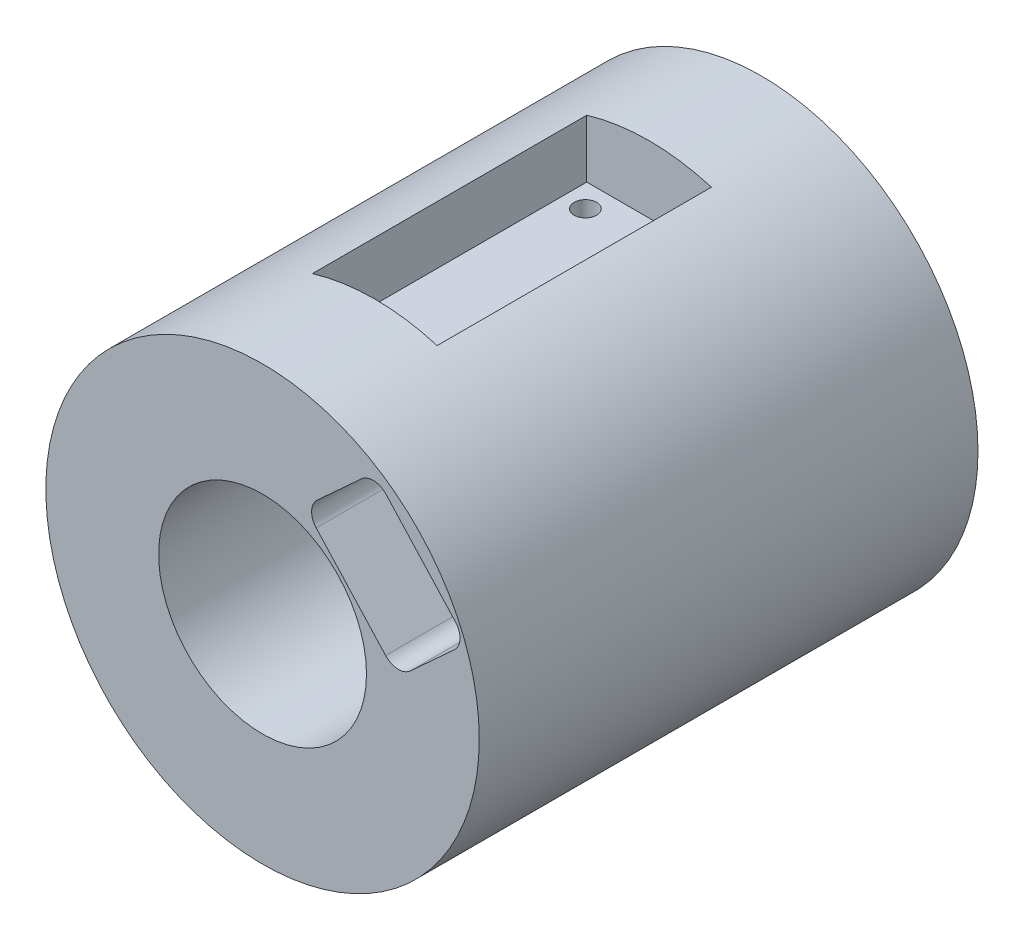
ISO-10303-21;
HEADER;
FILE_DESCRIPTION(('STEP AP214'),'2;1');
FILE_NAME('part.step','',(''),(''),'','','');
FILE_SCHEMA(('AUTOMOTIVE_DESIGN { 1 0 10303 214 1 1 1 1 }'));
ENDSEC;
DATA;
#1=APPLICATION_CONTEXT('core data for automotive mechanical design processes');
#2=APPLICATION_PROTOCOL_DEFINITION('international standard','automotive_design',2000,#1);
#3=PRODUCT_CONTEXT('',#1,'mechanical');
#4=PRODUCT('Part','Part','',(#3));
#5=PRODUCT_RELATED_PRODUCT_CATEGORY('part','',(#4));
#6=PRODUCT_DEFINITION_FORMATION('','',#4);
#7=PRODUCT_DEFINITION_CONTEXT('part definition',#1,'design');
#8=PRODUCT_DEFINITION('design','',#6,#7);
#9=PRODUCT_DEFINITION_SHAPE('','',#8);
#10=(LENGTH_UNIT() NAMED_UNIT(*) SI_UNIT(.MILLI.,.METRE.));
#11=(NAMED_UNIT(*) PLANE_ANGLE_UNIT() SI_UNIT($,.RADIAN.));
#12=(NAMED_UNIT(*) SI_UNIT($,.STERADIAN.) SOLID_ANGLE_UNIT());
#13=UNCERTAINTY_MEASURE_WITH_UNIT(LENGTH_MEASURE(1.E-05),#10,'distance_accuracy_value','');
#14=(GEOMETRIC_REPRESENTATION_CONTEXT(3) GLOBAL_UNCERTAINTY_ASSIGNED_CONTEXT((#13)) GLOBAL_UNIT_ASSIGNED_CONTEXT((#10,
#11,#12)) REPRESENTATION_CONTEXT('',''));
#15=CARTESIAN_POINT('',(0.,0.,0.));
#16=DIRECTION('',(0.,0.,1.));
#17=DIRECTION('',(1.,0.,0.));
#18=AXIS2_PLACEMENT_3D('',#15,#16,#17);
#19=CARTESIAN_POINT('',(0.,0.,100.));
#20=DIRECTION('',(0.,0.,-1.));
#21=DIRECTION('',(-1.,0.,0.));
#22=AXIS2_PLACEMENT_3D('',#19,#20,#21);
#23=CYLINDRICAL_SURFACE('',#22,43.45);
#24=CARTESIAN_POINT('',(0.,0.,100.));
#25=DIRECTION('',(0.,0.,1.));
#26=DIRECTION('',(1.,0.,0.));
#27=AXIS2_PLACEMENT_3D('',#24,#25,#26);
#28=CIRCLE('',#27,43.45);
#29=CARTESIAN_POINT('',(43.45,0.,100.));
#30=VERTEX_POINT('',#29);
#31=EDGE_CURVE('E321',#30,#30,#28,.T.);
#32=ORIENTED_EDGE('',*,*,#31,.F.);
#33=EDGE_LOOP('',(#32));
#34=FACE_BOUND('',#33,.T.);
#35=CARTESIAN_POINT('',(0.,0.,0.));
#36=DIRECTION('',(0.,0.,1.));
#37=DIRECTION('',(1.,0.,0.));
#38=AXIS2_PLACEMENT_3D('',#35,#36,#37);
#39=CIRCLE('',#38,43.45);
#40=CARTESIAN_POINT('',(43.45,0.,0.));
#41=VERTEX_POINT('',#40);
#42=EDGE_CURVE('E324',#41,#41,#39,.T.);
#43=ORIENTED_EDGE('',*,*,#42,.T.);
#44=EDGE_LOOP('',(#43));
#45=FACE_BOUND('',#44,.T.);
#46=CARTESIAN_POINT('',(0.,0.,77.5));
#47=DIRECTION('',(0.,0.,-1.));
#48=DIRECTION('',(-1.,0.,0.));
#49=AXIS2_PLACEMENT_3D('',#46,#47,#48);
#50=CIRCLE('',#49,43.45);
#51=CARTESIAN_POINT('',(-12.5,41.6131289378725,77.5));
#52=VERTEX_POINT('',#51);
#53=CARTESIAN_POINT('',(12.5,41.6131289378725,77.5));
#54=VERTEX_POINT('',#53);
#55=EDGE_CURVE('E327',#52,#54,#50,.T.);
#56=ORIENTED_EDGE('',*,*,#55,.F.);
#57=DIRECTION('',(0.,0.,-1.));
#58=VECTOR('',#57,1.);
#59=CARTESIAN_POINT('',(-12.5,41.6131289378725,100.));
#60=LINE('',#59,#58);
#61=CARTESIAN_POINT('',(-12.5,41.6131289378725,22.5));
#62=VERTEX_POINT('',#61);
#63=EDGE_CURVE('E50',#62,#52,#60,.F.);
#64=ORIENTED_EDGE('',*,*,#63,.F.);
#65=CARTESIAN_POINT('',(0.,0.,22.5));
#66=DIRECTION('',(0.,0.,1.));
#67=DIRECTION('',(1.,0.,0.));
#68=AXIS2_PLACEMENT_3D('',#65,#66,#67);
#69=CIRCLE('',#68,43.45);
#70=CARTESIAN_POINT('',(12.5,41.6131289378725,22.5));
#71=VERTEX_POINT('',#70);
#72=EDGE_CURVE('E334',#71,#62,#69,.T.);
#73=ORIENTED_EDGE('',*,*,#72,.F.);
#74=DIRECTION('',(0.,0.,-1.));
#75=VECTOR('',#74,1.);
#76=CARTESIAN_POINT('',(12.5,41.6131289378725,100.));
#77=LINE('',#76,#75);
#78=EDGE_CURVE('E330',#54,#71,#77,.T.);
#79=ORIENTED_EDGE('',*,*,#78,.F.);
#80=EDGE_LOOP('',(#56,#64,#73,#79));
#81=FACE_BOUND('',#80,.T.);
#82=ADVANCED_FACE('F42',(#34,#45,#81),#23,.T.);
#83=CARTESIAN_POINT('',(0.,0.,100.));
#84=DIRECTION('',(0.,0.,1.));
#85=DIRECTION('',(1.,0.,0.));
#86=AXIS2_PLACEMENT_3D('',#83,#84,#85);
#87=PLANE('',#86);
#88=CARTESIAN_POINT('',(22.1825162241844,30.8000411733465,100.));
#89=DIRECTION('',(0.,0.,1.));
#90=DIRECTION('',(1.,0.,0.));
#91=AXIS2_PLACEMENT_3D('',#88,#89,#90);
#92=CIRCLE('',#91,3.50000000000001);
#93=CARTESIAN_POINT('',(24.7629869029752,33.16460690005,100.));
#94=VERTEX_POINT('',#93);
#95=CARTESIAN_POINT('',(19.8179504974809,33.3805118521373,100.));
#96=VERTEX_POINT('',#95);
#97=EDGE_CURVE('E57',#94,#96,#92,.T.);
#98=ORIENTED_EDGE('',*,*,#97,.F.);
#99=DIRECTION('',(-0.675590207629567,0.737277336797381,0.));
#100=VECTOR('',#99,1.);
#101=CARTESIAN_POINT('',(38.6801451801443,17.976693762024,100.));
#102=LINE('',#101,#100);
#103=CARTESIAN_POINT('',(38.6801451801443,17.976693762024,100.));
#104=VERTEX_POINT('',#103);
#105=EDGE_CURVE('E166',#104,#94,#102,.T.);
#106=ORIENTED_EDGE('',*,*,#105,.F.);
#107=CARTESIAN_POINT('',(36.0996745013535,15.6121280353205,100.));
#108=DIRECTION('',(0.,0.,1.));
#109=DIRECTION('',(1.,0.,0.));
#110=AXIS2_PLACEMENT_3D('',#107,#108,#109);
#111=CIRCLE('',#110,3.5);
#112=CARTESIAN_POINT('',(38.4642402280569,13.0316573565296,100.));
#113=VERTEX_POINT('',#112);
#114=EDGE_CURVE('E170',#113,#104,#111,.T.);
#115=ORIENTED_EDGE('',*,*,#114,.F.);
#116=DIRECTION('',(0.737277336797381,0.675590207629567,0.));
#117=VECTOR('',#116,1.);
#118=CARTESIAN_POINT('',(29.6169121864884,4.92457486497485,100.));
#119=LINE('',#118,#117);
#120=CARTESIAN_POINT('',(29.6169121864884,4.92457486497485,100.));
#121=VERTEX_POINT('',#120);
#122=EDGE_CURVE('E209',#121,#113,#119,.T.);
#123=ORIENTED_EDGE('',*,*,#122,.F.);
#124=CARTESIAN_POINT('',(27.2523464597849,7.50504554376566,100.));
#125=DIRECTION('',(0.,0.,1.));
#126=DIRECTION('',(1.,0.,0.));
#127=AXIS2_PLACEMENT_3D('',#124,#125,#126);
#128=CIRCLE('',#127,3.5);
#129=CARTESIAN_POINT('',(24.671875780994,5.14047981706219,100.));
#130=VERTEX_POINT('',#129);
#131=EDGE_CURVE('E205',#130,#121,#128,.T.);
#132=ORIENTED_EDGE('',*,*,#131,.F.);
#133=DIRECTION('',(0.675590207629567,-0.737277336797381,0.));
#134=VECTOR('',#133,1.);
#135=CARTESIAN_POINT('',(10.754717503825,20.3283929550882,100.));
#136=LINE('',#135,#134);
#137=CARTESIAN_POINT('',(10.754717503825,20.3283929550882,100.));
#138=VERTEX_POINT('',#137);
#139=EDGE_CURVE('E201',#138,#130,#136,.T.);
#140=ORIENTED_EDGE('',*,*,#139,.F.);
#141=CARTESIAN_POINT('',(13.3351881826158,22.6929586817917,100.));
#142=DIRECTION('',(0.,0.,1.));
#143=DIRECTION('',(1.,0.,0.));
#144=AXIS2_PLACEMENT_3D('',#141,#142,#143);
#145=CIRCLE('',#144,3.5);
#146=CARTESIAN_POINT('',(10.9706224559123,25.2734293605826,100.));
#147=VERTEX_POINT('',#146);
#148=EDGE_CURVE('E197',#147,#138,#145,.T.);
#149=ORIENTED_EDGE('',*,*,#148,.F.);
#150=DIRECTION('',(-0.737277336797381,-0.675590207629567,0.));
#151=VECTOR('',#150,1.);
#152=CARTESIAN_POINT('',(19.8179504974809,33.3805118521373,100.));
#153=LINE('',#152,#151);
#154=EDGE_CURVE('E194',#96,#147,#153,.T.);
#155=ORIENTED_EDGE('',*,*,#154,.F.);
#156=EDGE_LOOP('',(#98,#106,#115,#123,#132,#140,#149,#155));
#157=FACE_BOUND('',#156,.T.);
#158=ORIENTED_EDGE('',*,*,#31,.T.);
#159=EDGE_LOOP('',(#158));
#160=FACE_BOUND('',#159,.T.);
#161=CARTESIAN_POINT('',(0.,0.,100.));
#162=DIRECTION('',(0.,0.,1.));
#163=DIRECTION('',(1.,0.,0.));
#164=AXIS2_PLACEMENT_3D('',#161,#162,#163);
#165=CIRCLE('',#164,20.8375);
#166=CARTESIAN_POINT('',(20.8375,0.,100.));
#167=VERTEX_POINT('',#166);
#168=EDGE_CURVE('E358',#167,#167,#165,.T.);
#169=ORIENTED_EDGE('',*,*,#168,.F.);
#170=EDGE_LOOP('',(#169));
#171=FACE_BOUND('',#170,.T.);
#172=ADVANCED_FACE('F305',(#157,#160,#171),#87,.T.);
#173=CARTESIAN_POINT('',(0.,0.,0.));
#174=DIRECTION('',(0.,0.,1.));
#175=DIRECTION('',(1.,0.,0.));
#176=AXIS2_PLACEMENT_3D('',#173,#174,#175);
#177=PLANE('',#176);
#178=ORIENTED_EDGE('',*,*,#42,.F.);
#179=EDGE_LOOP('',(#178));
#180=FACE_BOUND('',#179,.T.);
#181=CARTESIAN_POINT('',(0.,0.,0.));
#182=DIRECTION('',(0.,0.,1.));
#183=DIRECTION('',(1.,0.,0.));
#184=AXIS2_PLACEMENT_3D('',#181,#182,#183);
#185=CIRCLE('',#184,20.8375);
#186=CARTESIAN_POINT('',(20.8375,0.,0.));
#187=VERTEX_POINT('',#186);
#188=EDGE_CURVE('E357',#187,#187,#185,.T.);
#189=ORIENTED_EDGE('',*,*,#188,.T.);
#190=EDGE_LOOP('',(#189));
#191=FACE_BOUND('',#190,.T.);
#192=ADVANCED_FACE('F303',(#180,#191),#177,.F.);
#193=CARTESIAN_POINT('',(0.,0.,100.));
#194=DIRECTION('',(0.,0.,-1.));
#195=DIRECTION('',(-1.,0.,0.));
#196=AXIS2_PLACEMENT_3D('',#193,#194,#195);
#197=CYLINDRICAL_SURFACE('',#196,20.8375);
#198=ORIENTED_EDGE('',*,*,#168,.T.);
#199=EDGE_LOOP('',(#198));
#200=FACE_BOUND('',#199,.T.);
#201=ORIENTED_EDGE('',*,*,#188,.F.);
#202=EDGE_LOOP('',(#201));
#203=FACE_BOUND('',#202,.T.);
#204=ADVANCED_FACE('F299',(#200,#203),#197,.F.);
#205=CARTESIAN_POINT('',(12.5,43.45,77.5));
#206=DIRECTION('',(-1.,0.,0.));
#207=DIRECTION('',(0.,0.,1.));
#208=AXIS2_PLACEMENT_3D('',#205,#206,#207);
#209=PLANE('',#208);
#210=ORIENTED_EDGE('',*,*,#78,.T.);
#211=DIRECTION('',(0.,-1.,0.));
#212=VECTOR('',#211,1.);
#213=CARTESIAN_POINT('',(12.5,43.45,22.5));
#214=LINE('',#213,#212);
#215=CARTESIAN_POINT('',(12.5,30.,22.5));
#216=VERTEX_POINT('',#215);
#217=EDGE_CURVE('E350',#71,#216,#214,.T.);
#218=ORIENTED_EDGE('',*,*,#217,.T.);
#219=DIRECTION('',(0.,0.,-1.));
#220=VECTOR('',#219,1.);
#221=CARTESIAN_POINT('',(12.5,30.,77.5));
#222=LINE('',#221,#220);
#223=CARTESIAN_POINT('',(12.5,30.,77.5));
#224=VERTEX_POINT('',#223);
#225=EDGE_CURVE('E381',#224,#216,#222,.T.);
#226=ORIENTED_EDGE('',*,*,#225,.F.);
#227=DIRECTION('',(0.,-1.,0.));
#228=VECTOR('',#227,1.);
#229=CARTESIAN_POINT('',(12.5,43.45,77.5));
#230=LINE('',#229,#228);
#231=EDGE_CURVE('E346',#54,#224,#230,.T.);
#232=ORIENTED_EDGE('',*,*,#231,.F.);
#233=EDGE_LOOP('',(#210,#218,#226,#232));
#234=FACE_BOUND('',#233,.T.);
#235=ADVANCED_FACE('F295',(#234),#209,.T.);
#236=CARTESIAN_POINT('',(-12.5,43.45,22.5));
#237=DIRECTION('',(0.,0.,1.));
#238=DIRECTION('',(1.,0.,0.));
#239=AXIS2_PLACEMENT_3D('',#236,#237,#238);
#240=PLANE('',#239);
#241=ORIENTED_EDGE('',*,*,#217,.F.);
#242=ORIENTED_EDGE('',*,*,#72,.T.);
#243=DIRECTION('',(0.,-1.,0.));
#244=VECTOR('',#243,1.);
#245=CARTESIAN_POINT('',(-12.5,43.45,22.5));
#246=LINE('',#245,#244);
#247=CARTESIAN_POINT('',(-12.5,30.,22.5));
#248=VERTEX_POINT('',#247);
#249=EDGE_CURVE('E340',#62,#248,#246,.T.);
#250=ORIENTED_EDGE('',*,*,#249,.T.);
#251=DIRECTION('',(-1.,0.,0.));
#252=VECTOR('',#251,1.);
#253=CARTESIAN_POINT('',(-12.5,30.,22.5));
#254=LINE('',#253,#252);
#255=EDGE_CURVE('E376',#216,#248,#254,.T.);
#256=ORIENTED_EDGE('',*,*,#255,.F.);
#257=EDGE_LOOP('',(#241,#242,#250,#256));
#258=FACE_BOUND('',#257,.T.);
#259=ADVANCED_FACE('F291',(#258),#240,.T.);
#260=CARTESIAN_POINT('',(-12.5,43.45,77.5));
#261=DIRECTION('',(1.,0.,0.));
#262=DIRECTION('',(0.,0.,-1.));
#263=AXIS2_PLACEMENT_3D('',#260,#261,#262);
#264=PLANE('',#263);
#265=ORIENTED_EDGE('',*,*,#63,.T.);
#266=DIRECTION('',(0.,-1.,0.));
#267=VECTOR('',#266,1.);
#268=CARTESIAN_POINT('',(-12.5,43.45,77.5));
#269=LINE('',#268,#267);
#270=CARTESIAN_POINT('',(-12.5,30.,77.5));
#271=VERTEX_POINT('',#270);
#272=EDGE_CURVE('E338',#52,#271,#269,.T.);
#273=ORIENTED_EDGE('',*,*,#272,.T.);
#274=DIRECTION('',(0.,0.,1.));
#275=VECTOR('',#274,1.);
#276=CARTESIAN_POINT('',(-12.5,30.,77.5));
#277=LINE('',#276,#275);
#278=EDGE_CURVE('E380',#248,#271,#277,.T.);
#279=ORIENTED_EDGE('',*,*,#278,.F.);
#280=ORIENTED_EDGE('',*,*,#249,.F.);
#281=EDGE_LOOP('',(#265,#273,#279,#280));
#282=FACE_BOUND('',#281,.T.);
#283=ADVANCED_FACE('F287',(#282),#264,.T.);
#284=CARTESIAN_POINT('',(-12.5,43.45,77.5));
#285=DIRECTION('',(0.,0.,-1.));
#286=DIRECTION('',(-1.,0.,0.));
#287=AXIS2_PLACEMENT_3D('',#284,#285,#286);
#288=PLANE('',#287);
#289=ORIENTED_EDGE('',*,*,#272,.F.);
#290=ORIENTED_EDGE('',*,*,#55,.T.);
#291=ORIENTED_EDGE('',*,*,#231,.T.);
#292=DIRECTION('',(1.,0.,0.));
#293=VECTOR('',#292,1.);
#294=CARTESIAN_POINT('',(-12.5,30.,77.5));
#295=LINE('',#294,#293);
#296=EDGE_CURVE('E344',#271,#224,#295,.T.);
#297=ORIENTED_EDGE('',*,*,#296,.F.);
#298=EDGE_LOOP('',(#289,#290,#291,#297));
#299=FACE_BOUND('',#298,.T.);
#300=ADVANCED_FACE('F283',(#299),#288,.T.);
#301=CARTESIAN_POINT('',(0.,30.,0.));
#302=DIRECTION('',(0.,-1.,0.));
#303=DIRECTION('',(0.,0.,-1.));
#304=AXIS2_PLACEMENT_3D('',#301,#302,#303);
#305=PLANE('',#304);
#306=CARTESIAN_POINT('',(-8.001,30.,27.267));
#307=DIRECTION('',(0.,1.,0.));
#308=DIRECTION('',(0.,0.,1.));
#309=AXIS2_PLACEMENT_3D('',#306,#307,#308);
#310=CIRCLE('',#309,2.25);
#311=CARTESIAN_POINT('',(-8.001,30.,29.517));
#312=VERTEX_POINT('',#311);
#313=EDGE_CURVE('E396',#312,#312,#310,.T.);
#314=ORIENTED_EDGE('',*,*,#313,.F.);
#315=EDGE_LOOP('',(#314));
#316=FACE_BOUND('',#315,.T.);
#317=CARTESIAN_POINT('',(8.001,30.,72.733));
#318=DIRECTION('',(0.,1.,0.));
#319=DIRECTION('',(0.,0.,1.));
#320=AXIS2_PLACEMENT_3D('',#317,#318,#319);
#321=CIRCLE('',#320,2.25);
#322=CARTESIAN_POINT('',(8.001,30.,74.983));
#323=VERTEX_POINT('',#322);
#324=EDGE_CURVE('E402',#323,#323,#321,.T.);
#325=ORIENTED_EDGE('',*,*,#324,.F.);
#326=EDGE_LOOP('',(#325));
#327=FACE_BOUND('',#326,.T.);
#328=CARTESIAN_POINT('',(-8.001,30.,72.733));
#329=DIRECTION('',(0.,1.,0.));
#330=DIRECTION('',(0.,0.,1.));
#331=AXIS2_PLACEMENT_3D('',#328,#329,#330);
#332=CIRCLE('',#331,2.25);
#333=CARTESIAN_POINT('',(-8.001,30.,74.983));
#334=VERTEX_POINT('',#333);
#335=EDGE_CURVE('E271',#334,#334,#332,.T.);
#336=ORIENTED_EDGE('',*,*,#335,.F.);
#337=EDGE_LOOP('',(#336));
#338=FACE_BOUND('',#337,.T.);
#339=CARTESIAN_POINT('',(8.001,30.,27.267));
#340=DIRECTION('',(0.,1.,0.));
#341=DIRECTION('',(0.,0.,1.));
#342=AXIS2_PLACEMENT_3D('',#339,#340,#341);
#343=CIRCLE('',#342,2.25);
#344=CARTESIAN_POINT('',(8.001,30.,29.517));
#345=VERTEX_POINT('',#344);
#346=EDGE_CURVE('E388',#345,#345,#343,.T.);
#347=ORIENTED_EDGE('',*,*,#346,.F.);
#348=EDGE_LOOP('',(#347));
#349=FACE_BOUND('',#348,.T.);
#350=ORIENTED_EDGE('',*,*,#225,.T.);
#351=ORIENTED_EDGE('',*,*,#255,.T.);
#352=ORIENTED_EDGE('',*,*,#278,.T.);
#353=ORIENTED_EDGE('',*,*,#296,.T.);
#354=EDGE_LOOP('',(#350,#351,#352,#353));
#355=FACE_BOUND('',#354,.T.);
#356=ADVANCED_FACE('F279',(#316,#327,#338,#349,#355),#305,.F.);
#357=CARTESIAN_POINT('',(8.001,24.,27.267));
#358=DIRECTION('',(0.,1.,0.));
#359=DIRECTION('',(0.,0.,1.));
#360=AXIS2_PLACEMENT_3D('',#357,#358,#359);
#361=CYLINDRICAL_SURFACE('',#360,2.25);
#362=CARTESIAN_POINT('',(8.001,24.,27.267));
#363=DIRECTION('',(0.,1.,0.));
#364=DIRECTION('',(0.,0.,1.));
#365=AXIS2_PLACEMENT_3D('',#362,#363,#364);
#366=CIRCLE('',#365,2.25);
#367=CARTESIAN_POINT('',(10.0883985385988,24.,26.4271980346202));
#368=VERTEX_POINT('',#367);
#369=CARTESIAN_POINT('',(10.0883985385988,24.,28.1068019653798));
#370=VERTEX_POINT('',#369);
#371=EDGE_CURVE('E384',#368,#370,#366,.T.);
#372=ORIENTED_EDGE('',*,*,#371,.F.);
#373=CARTESIAN_POINT('',(10.0883985385988,24.,26.4271980346202));
#374=CARTESIAN_POINT('',(10.1059207392258,24.0435582055491,26.4706734148812));
#375=CARTESIAN_POINT('',(10.1231965531728,24.083905494025,26.5176121622559));
#376=CARTESIAN_POINT('',(10.1559310296601,24.1571719181778,26.6177529832095));
#377=CARTESIAN_POINT('',(10.1713839018395,24.1900676740743,26.6709739946137));
#378=CARTESIAN_POINT('',(10.1990703572107,24.2472397914526,26.7829299776529));
#379=CARTESIAN_POINT('',(10.2112926204698,24.2714859461289,26.841683384567));
#380=CARTESIAN_POINT('',(10.2312062201158,24.3102946068298,26.9629538289935));
#381=CARTESIAN_POINT('',(10.2389044035379,24.3248717508855,27.0254650203383));
#382=CARTESIAN_POINT('',(10.2488353946607,24.3435758963437,27.150565775961));
#383=CARTESIAN_POINT('',(10.2512224947598,24.3479980379427,27.2130988057367));
#384=CARTESIAN_POINT('',(10.2507447451921,24.3471078766926,27.3380720929691));
#385=CARTESIAN_POINT('',(10.2478804994228,24.3417966931621,27.4005123602669));
#386=CARTESIAN_POINT('',(10.2374176813844,24.3220481426697,27.5208421155425));
#387=CARTESIAN_POINT('',(10.2300188675845,24.3079954864987,27.5788131258107));
#388=CARTESIAN_POINT('',(10.2113369859839,24.2715567124935,27.6914746029283));
#389=CARTESIAN_POINT('',(10.2000493101854,24.2491607058685,27.7461610871862));
#390=CARTESIAN_POINT('',(10.1733148154456,24.194148184426,27.8561098307461));
#391=CARTESIAN_POINT('',(10.1575685835785,24.160744480772,27.910902139822));
#392=CARTESIAN_POINT('',(10.1240979748178,24.086009637365,28.0139443606965));
#393=CARTESIAN_POINT('',(10.1063776964941,24.0446947992156,28.0622073836125));
#394=CARTESIAN_POINT('',(10.0883985385988,24.,28.1068019653798));
#395=B_SPLINE_CURVE_WITH_KNOTS('',3,(#373,#374,#375,#376,#377,#378,#379,#380,#381,#382,#383,
#384,#385,#386,#387,#388,#389,#390,#391,#392,#393,#394),.UNSPECIFIED.,.F.,.F.,(4,2,2,2,2,2,2,2,
2,2,4),(0.,0.191951563302821,0.384497295691138,0.577709016190949,0.770627559446493,
0.957864122839834,1.14507915564197,1.32458686799601,1.50430801872356,1.7016625109198,
1.89861462949543),.UNSPECIFIED.);
#396=EDGE_CURVE('E64',#368,#370,#395,.T.);
#397=ORIENTED_EDGE('',*,*,#396,.T.);
#398=EDGE_LOOP('',(#372,#397));
#399=FACE_BOUND('',#398,.T.);
#400=ORIENTED_EDGE('',*,*,#346,.T.);
#401=EDGE_LOOP('',(#400));
#402=FACE_BOUND('',#401,.T.);
#403=ADVANCED_FACE('F273',(#399,#402),#361,.F.);
#404=CARTESIAN_POINT('',(8.001,24.,27.267));
#405=DIRECTION('',(0.,1.,0.));
#406=DIRECTION('',(0.,0.,1.));
#407=AXIS2_PLACEMENT_3D('',#404,#405,#406);
#408=PLANE('',#407);
#409=DIRECTION('',(0.,0.,1.));
#410=VECTOR('',#409,1.);
#411=CARTESIAN_POINT('',(10.0883985385988,24.,25.));
#412=LINE('',#411,#410);
#413=EDGE_CURVE('E246',#368,#370,#412,.T.);
#414=ORIENTED_EDGE('',*,*,#413,.F.);
#415=ORIENTED_EDGE('',*,*,#371,.T.);
#416=EDGE_LOOP('',(#414,#415));
#417=FACE_BOUND('',#416,.T.);
#418=ADVANCED_FACE('F278',(#417),#408,.T.);
#419=CARTESIAN_POINT('',(-8.001,24.,72.733));
#420=DIRECTION('',(0.,1.,0.));
#421=DIRECTION('',(0.,0.,1.));
#422=AXIS2_PLACEMENT_3D('',#419,#420,#421);
#423=CYLINDRICAL_SURFACE('',#422,2.25);
#424=CARTESIAN_POINT('',(-8.001,24.,72.733));
#425=DIRECTION('',(0.,1.,0.));
#426=DIRECTION('',(0.,0.,1.));
#427=AXIS2_PLACEMENT_3D('',#424,#425,#426);
#428=CIRCLE('',#427,2.25);
#429=CARTESIAN_POINT('',(-8.001,24.,74.983));
#430=VERTEX_POINT('',#429);
#431=EDGE_CURVE('E270',#430,#430,#428,.T.);
#432=ORIENTED_EDGE('',*,*,#431,.F.);
#433=EDGE_LOOP('',(#432));
#434=FACE_BOUND('',#433,.T.);
#435=ORIENTED_EDGE('',*,*,#335,.T.);
#436=EDGE_LOOP('',(#435));
#437=FACE_BOUND('',#436,.T.);
#438=ADVANCED_FACE('F420',(#434,#437),#423,.F.);
#439=CARTESIAN_POINT('',(-8.001,24.,72.733));
#440=DIRECTION('',(0.,1.,0.));
#441=DIRECTION('',(0.,0.,1.));
#442=AXIS2_PLACEMENT_3D('',#439,#440,#441);
#443=PLANE('',#442);
#444=ORIENTED_EDGE('',*,*,#431,.T.);
#445=EDGE_LOOP('',(#444));
#446=FACE_BOUND('',#445,.T.);
#447=ADVANCED_FACE('F426',(#446),#443,.T.);
#448=CARTESIAN_POINT('',(8.001,24.,72.733));
#449=DIRECTION('',(0.,1.,0.));
#450=DIRECTION('',(0.,0.,1.));
#451=AXIS2_PLACEMENT_3D('',#448,#449,#450);
#452=CYLINDRICAL_SURFACE('',#451,2.25);
#453=CARTESIAN_POINT('',(8.001,24.,72.733));
#454=DIRECTION('',(0.,1.,0.));
#455=DIRECTION('',(0.,0.,1.));
#456=AXIS2_PLACEMENT_3D('',#453,#454,#455);
#457=CIRCLE('',#456,2.25);
#458=CARTESIAN_POINT('',(10.0883985385988,24.,71.8931980346202));
#459=VERTEX_POINT('',#458);
#460=CARTESIAN_POINT('',(10.0883985385988,24.,73.5728019653798));
#461=VERTEX_POINT('',#460);
#462=EDGE_CURVE('E398',#459,#461,#457,.T.);
#463=ORIENTED_EDGE('',*,*,#462,.F.);
#464=CARTESIAN_POINT('',(10.0883985385988,24.,71.8931980346202));
#465=CARTESIAN_POINT('',(10.1059207392258,24.0435582055491,71.9366734148812));
#466=CARTESIAN_POINT('',(10.1231965531728,24.083905494025,71.9836121622559));
#467=CARTESIAN_POINT('',(10.1559310296601,24.1571719181778,72.0837529832095));
#468=CARTESIAN_POINT('',(10.1713839018395,24.1900676740744,72.1369739946137));
#469=CARTESIAN_POINT('',(10.1990703572107,24.2472397914526,72.2489299776529));
#470=CARTESIAN_POINT('',(10.2112926204698,24.2714859461289,72.307683384567));
#471=CARTESIAN_POINT('',(10.2312062201158,24.3102946068298,72.4289538289935));
#472=CARTESIAN_POINT('',(10.2389044035379,24.3248717508855,72.4914650203383));
#473=CARTESIAN_POINT('',(10.2488353946607,24.3435758963437,72.616565775961));
#474=CARTESIAN_POINT('',(10.2512224947598,24.3479980379428,72.6790988057368));
#475=CARTESIAN_POINT('',(10.2507447451921,24.3471078766926,72.8040720929691));
#476=CARTESIAN_POINT('',(10.2478804994228,24.3417966931621,72.8665123602669));
#477=CARTESIAN_POINT('',(10.2374176813844,24.3220481426697,72.9868421155425));
#478=CARTESIAN_POINT('',(10.2300188675844,24.3079954864987,73.0448131258107));
#479=CARTESIAN_POINT('',(10.2113369859839,24.2715567124935,73.1574746029283));
#480=CARTESIAN_POINT('',(10.2000493101854,24.2491607058685,73.2121610871862));
#481=CARTESIAN_POINT('',(10.1733148154456,24.194148184426,73.3221098307461));
#482=CARTESIAN_POINT('',(10.1575685835785,24.160744480772,73.376902139822));
#483=CARTESIAN_POINT('',(10.1240979748178,24.086009637365,73.4799443606965));
#484=CARTESIAN_POINT('',(10.1063776964941,24.0446947992156,73.5282073836125));
#485=CARTESIAN_POINT('',(10.0883985385988,24.,73.5728019653798));
#486=B_SPLINE_CURVE_WITH_KNOTS('',3,(#464,#465,#466,#467,#468,#469,#470,#471,#472,#473,#474,
#475,#476,#477,#478,#479,#480,#481,#482,#483,#484,#485),.UNSPECIFIED.,.F.,.F.,(4,2,2,2,2,2,2,2,
2,2,4),(0.,0.191951563302823,0.384497295691151,0.57770901619097,0.770627559446516,
0.957864122839859,1.14507915564198,1.324586867996,1.50430801872357,1.7016625109198,
1.89861462949543),.UNSPECIFIED.);
#487=EDGE_CURVE('E219',#459,#461,#486,.T.);
#488=ORIENTED_EDGE('',*,*,#487,.T.);
#489=EDGE_LOOP('',(#463,#488));
#490=FACE_BOUND('',#489,.T.);
#491=ORIENTED_EDGE('',*,*,#324,.T.);
#492=EDGE_LOOP('',(#491));
#493=FACE_BOUND('',#492,.T.);
#494=ADVANCED_FACE('F248',(#490,#493),#452,.F.);
#495=CARTESIAN_POINT('',(8.001,24.,72.733));
#496=DIRECTION('',(0.,1.,0.));
#497=DIRECTION('',(0.,0.,1.));
#498=AXIS2_PLACEMENT_3D('',#495,#496,#497);
#499=PLANE('',#498);
#500=DIRECTION('',(0.,0.,1.));
#501=VECTOR('',#500,1.);
#502=CARTESIAN_POINT('',(10.0883985385988,24.,25.));
#503=LINE('',#502,#501);
#504=EDGE_CURVE('E11',#459,#461,#503,.T.);
#505=ORIENTED_EDGE('',*,*,#504,.F.);
#506=ORIENTED_EDGE('',*,*,#462,.T.);
#507=EDGE_LOOP('',(#505,#506));
#508=FACE_BOUND('',#507,.T.);
#509=ADVANCED_FACE('F438',(#508),#499,.T.);
#510=CARTESIAN_POINT('',(-8.001,24.,27.267));
#511=DIRECTION('',(0.,1.,0.));
#512=DIRECTION('',(0.,0.,1.));
#513=AXIS2_PLACEMENT_3D('',#510,#511,#512);
#514=CYLINDRICAL_SURFACE('',#513,2.25);
#515=CARTESIAN_POINT('',(-8.001,24.,27.267));
#516=DIRECTION('',(0.,1.,0.));
#517=DIRECTION('',(0.,0.,1.));
#518=AXIS2_PLACEMENT_3D('',#515,#516,#517);
#519=CIRCLE('',#518,2.25);
#520=CARTESIAN_POINT('',(-8.001,24.,29.517));
#521=VERTEX_POINT('',#520);
#522=EDGE_CURVE('E406',#521,#521,#519,.T.);
#523=ORIENTED_EDGE('',*,*,#522,.F.);
#524=EDGE_LOOP('',(#523));
#525=FACE_BOUND('',#524,.T.);
#526=ORIENTED_EDGE('',*,*,#313,.T.);
#527=EDGE_LOOP('',(#526));
#528=FACE_BOUND('',#527,.T.);
#529=ADVANCED_FACE('F436',(#525,#528),#514,.F.);
#530=CARTESIAN_POINT('',(-8.001,24.,27.267));
#531=DIRECTION('',(0.,1.,0.));
#532=DIRECTION('',(0.,0.,1.));
#533=AXIS2_PLACEMENT_3D('',#530,#531,#532);
#534=PLANE('',#533);
#535=ORIENTED_EDGE('',*,*,#522,.T.);
#536=EDGE_LOOP('',(#535));
#537=FACE_BOUND('',#536,.T.);
#538=ADVANCED_FACE('F257',(#537),#534,.T.);
#539=CARTESIAN_POINT('',(13.3351881826158,22.6929586817917,25.));
#540=DIRECTION('',(0.,0.,1.));
#541=DIRECTION('',(1.,0.,0.));
#542=AXIS2_PLACEMENT_3D('',#539,#540,#541);
#543=CYLINDRICAL_SURFACE('',#542,3.5);
#544=ORIENTED_EDGE('',*,*,#148,.T.);
#545=DIRECTION('',(0.,0.,1.));
#546=VECTOR('',#545,1.);
#547=CARTESIAN_POINT('',(10.754717503825,20.3283929550882,25.));
#548=LINE('',#547,#546);
#549=CARTESIAN_POINT('',(10.754717503825,20.3283929550882,25.));
#550=VERTEX_POINT('',#549);
#551=EDGE_CURVE('E232',#550,#138,#548,.T.);
#552=ORIENTED_EDGE('',*,*,#551,.F.);
#553=CARTESIAN_POINT('',(13.3351881826158,22.6929586817917,25.));
#554=DIRECTION('',(0.,0.,1.));
#555=DIRECTION('',(1.,0.,0.));
#556=AXIS2_PLACEMENT_3D('',#553,#554,#555);
#557=CIRCLE('',#556,3.5);
#558=CARTESIAN_POINT('',(10.9706224559123,25.2734293605826,25.));
#559=VERTEX_POINT('',#558);
#560=EDGE_CURVE('E160',#559,#550,#557,.T.);
#561=ORIENTED_EDGE('',*,*,#560,.F.);
#562=DIRECTION('',(0.,0.,1.));
#563=VECTOR('',#562,1.);
#564=CARTESIAN_POINT('',(10.9706224559123,25.2734293605826,25.));
#565=LINE('',#564,#563);
#566=EDGE_CURVE('E150',#559,#147,#565,.T.);
#567=ORIENTED_EDGE('',*,*,#566,.T.);
#568=EDGE_LOOP('',(#544,#552,#561,#567));
#569=FACE_BOUND('',#568,.T.);
#570=ORIENTED_EDGE('',*,*,#504,.T.);
#571=ORIENTED_EDGE('',*,*,#487,.F.);
#572=EDGE_LOOP('',(#570,#571));
#573=FACE_BOUND('',#572,.T.);
#574=ORIENTED_EDGE('',*,*,#413,.T.);
#575=ORIENTED_EDGE('',*,*,#396,.F.);
#576=EDGE_LOOP('',(#574,#575));
#577=FACE_BOUND('',#576,.T.);
#578=ADVANCED_FACE('F252',(#569,#573,#577),#543,.F.);
#579=CARTESIAN_POINT('',(22.1825162241844,30.8000411733465,25.));
#580=DIRECTION('',(0.,0.,1.));
#581=DIRECTION('',(1.,0.,0.));
#582=AXIS2_PLACEMENT_3D('',#579,#580,#581);
#583=CYLINDRICAL_SURFACE('',#582,3.50000000000001);
#584=ORIENTED_EDGE('',*,*,#97,.T.);
#585=DIRECTION('',(0.,0.,1.));
#586=VECTOR('',#585,1.);
#587=CARTESIAN_POINT('',(19.8179504974809,33.3805118521373,25.));
#588=LINE('',#587,#586);
#589=CARTESIAN_POINT('',(19.8179504974809,33.3805118521373,25.));
#590=VERTEX_POINT('',#589);
#591=EDGE_CURVE('E140',#590,#96,#588,.T.);
#592=ORIENTED_EDGE('',*,*,#591,.F.);
#593=CARTESIAN_POINT('',(22.1825162241844,30.8000411733465,25.));
#594=DIRECTION('',(0.,0.,1.));
#595=DIRECTION('',(1.,0.,0.));
#596=AXIS2_PLACEMENT_3D('',#593,#594,#595);
#597=CIRCLE('',#596,3.50000000000001);
#598=CARTESIAN_POINT('',(24.7629869029752,33.16460690005,25.));
#599=VERTEX_POINT('',#598);
#600=EDGE_CURVE('E144',#599,#590,#597,.T.);
#601=ORIENTED_EDGE('',*,*,#600,.F.);
#602=DIRECTION('',(0.,0.,1.));
#603=VECTOR('',#602,1.);
#604=CARTESIAN_POINT('',(24.7629869029752,33.16460690005,25.));
#605=LINE('',#604,#603);
#606=EDGE_CURVE('E216',#599,#94,#605,.T.);
#607=ORIENTED_EDGE('',*,*,#606,.T.);
#608=EDGE_LOOP('',(#584,#592,#601,#607));
#609=FACE_BOUND('',#608,.T.);
#610=ADVANCED_FACE('F142',(#609),#583,.F.);
#611=CARTESIAN_POINT('',(38.6801451801443,17.976693762024,25.));
#612=DIRECTION('',(0.737277336797381,0.675590207629567,0.));
#613=DIRECTION('',(-0.675590207629567,0.737277336797381,0.));
#614=AXIS2_PLACEMENT_3D('',#611,#612,#613);
#615=PLANE('',#614);
#616=ORIENTED_EDGE('',*,*,#105,.T.);
#617=ORIENTED_EDGE('',*,*,#606,.F.);
#618=DIRECTION('',(-0.675590207629567,0.737277336797381,0.));
#619=VECTOR('',#618,1.);
#620=CARTESIAN_POINT('',(38.6801451801443,17.976693762024,25.));
#621=LINE('',#620,#619);
#622=CARTESIAN_POINT('',(38.6801451801443,17.976693762024,25.));
#623=VERTEX_POINT('',#622);
#624=EDGE_CURVE('E151',#623,#599,#621,.T.);
#625=ORIENTED_EDGE('',*,*,#624,.F.);
#626=DIRECTION('',(0.,0.,1.));
#627=VECTOR('',#626,1.);
#628=CARTESIAN_POINT('',(38.6801451801443,17.976693762024,25.));
#629=LINE('',#628,#627);
#630=EDGE_CURVE('E220',#623,#104,#629,.T.);
#631=ORIENTED_EDGE('',*,*,#630,.T.);
#632=EDGE_LOOP('',(#616,#617,#625,#631));
#633=FACE_BOUND('',#632,.T.);
#634=ADVANCED_FACE('F530',(#633),#615,.F.);
#635=CARTESIAN_POINT('',(36.0996745013535,15.6121280353205,25.));
#636=DIRECTION('',(0.,0.,1.));
#637=DIRECTION('',(1.,0.,0.));
#638=AXIS2_PLACEMENT_3D('',#635,#636,#637);
#639=CYLINDRICAL_SURFACE('',#638,3.5);
#640=ORIENTED_EDGE('',*,*,#114,.T.);
#641=ORIENTED_EDGE('',*,*,#630,.F.);
#642=CARTESIAN_POINT('',(36.0996745013535,15.6121280353205,25.));
#643=DIRECTION('',(0.,0.,1.));
#644=DIRECTION('',(1.,0.,0.));
#645=AXIS2_PLACEMENT_3D('',#642,#643,#644);
#646=CIRCLE('',#645,3.5);
#647=CARTESIAN_POINT('',(38.4642402280569,13.0316573565296,25.));
#648=VERTEX_POINT('',#647);
#649=EDGE_CURVE('E187',#648,#623,#646,.T.);
#650=ORIENTED_EDGE('',*,*,#649,.F.);
#651=DIRECTION('',(0.,0.,1.));
#652=VECTOR('',#651,1.);
#653=CARTESIAN_POINT('',(38.4642402280569,13.0316573565296,25.));
#654=LINE('',#653,#652);
#655=EDGE_CURVE('E223',#648,#113,#654,.T.);
#656=ORIENTED_EDGE('',*,*,#655,.T.);
#657=EDGE_LOOP('',(#640,#641,#650,#656));
#658=FACE_BOUND('',#657,.T.);
#659=ADVANCED_FACE('F538',(#658),#639,.F.);
#660=CARTESIAN_POINT('',(29.6169121864884,4.92457486497485,25.));
#661=DIRECTION('',(0.675590207629567,-0.737277336797381,0.));
#662=DIRECTION('',(0.737277336797381,0.675590207629567,0.));
#663=AXIS2_PLACEMENT_3D('',#660,#661,#662);
#664=PLANE('',#663);
#665=ORIENTED_EDGE('',*,*,#122,.T.);
#666=ORIENTED_EDGE('',*,*,#655,.F.);
#667=DIRECTION('',(0.737277336797381,0.675590207629567,0.));
#668=VECTOR('',#667,1.);
#669=CARTESIAN_POINT('',(29.6169121864884,4.92457486497485,25.));
#670=LINE('',#669,#668);
#671=CARTESIAN_POINT('',(29.6169121864884,4.92457486497485,25.));
#672=VERTEX_POINT('',#671);
#673=EDGE_CURVE('E183',#672,#648,#670,.T.);
#674=ORIENTED_EDGE('',*,*,#673,.F.);
#675=DIRECTION('',(0.,0.,1.));
#676=VECTOR('',#675,1.);
#677=CARTESIAN_POINT('',(29.6169121864884,4.92457486497485,25.));
#678=LINE('',#677,#676);
#679=EDGE_CURVE('E226',#672,#121,#678,.T.);
#680=ORIENTED_EDGE('',*,*,#679,.T.);
#681=EDGE_LOOP('',(#665,#666,#674,#680));
#682=FACE_BOUND('',#681,.T.);
#683=ADVANCED_FACE('F548',(#682),#664,.F.);
#684=CARTESIAN_POINT('',(27.2523464597849,7.50504554376566,25.));
#685=DIRECTION('',(0.,0.,1.));
#686=DIRECTION('',(1.,0.,0.));
#687=AXIS2_PLACEMENT_3D('',#684,#685,#686);
#688=CYLINDRICAL_SURFACE('',#687,3.5);
#689=ORIENTED_EDGE('',*,*,#131,.T.);
#690=ORIENTED_EDGE('',*,*,#679,.F.);
#691=CARTESIAN_POINT('',(27.2523464597849,7.50504554376566,25.));
#692=DIRECTION('',(0.,0.,1.));
#693=DIRECTION('',(1.,0.,0.));
#694=AXIS2_PLACEMENT_3D('',#691,#692,#693);
#695=CIRCLE('',#694,3.5);
#696=CARTESIAN_POINT('',(24.671875780994,5.14047981706219,25.));
#697=VERTEX_POINT('',#696);
#698=EDGE_CURVE('E179',#697,#672,#695,.T.);
#699=ORIENTED_EDGE('',*,*,#698,.F.);
#700=DIRECTION('',(0.,0.,1.));
#701=VECTOR('',#700,1.);
#702=CARTESIAN_POINT('',(24.671875780994,5.14047981706219,25.));
#703=LINE('',#702,#701);
#704=EDGE_CURVE('E229',#697,#130,#703,.T.);
#705=ORIENTED_EDGE('',*,*,#704,.T.);
#706=EDGE_LOOP('',(#689,#690,#699,#705));
#707=FACE_BOUND('',#706,.T.);
#708=ADVANCED_FACE('F558',(#707),#688,.F.);
#709=CARTESIAN_POINT('',(10.754717503825,20.3283929550882,25.));
#710=DIRECTION('',(-0.737277336797381,-0.675590207629567,0.));
#711=DIRECTION('',(0.675590207629567,-0.737277336797381,0.));
#712=AXIS2_PLACEMENT_3D('',#709,#710,#711);
#713=PLANE('',#712);
#714=ORIENTED_EDGE('',*,*,#139,.T.);
#715=ORIENTED_EDGE('',*,*,#704,.F.);
#716=DIRECTION('',(0.675590207629567,-0.737277336797381,0.));
#717=VECTOR('',#716,1.);
#718=CARTESIAN_POINT('',(10.754717503825,20.3283929550882,25.));
#719=LINE('',#718,#717);
#720=EDGE_CURVE('E175',#550,#697,#719,.T.);
#721=ORIENTED_EDGE('',*,*,#720,.F.);
#722=ORIENTED_EDGE('',*,*,#551,.T.);
#723=EDGE_LOOP('',(#714,#715,#721,#722));
#724=FACE_BOUND('',#723,.T.);
#725=ADVANCED_FACE('F259',(#724),#713,.F.);
#726=CARTESIAN_POINT('',(19.8179504974809,33.3805118521373,25.));
#727=DIRECTION('',(-0.675590207629567,0.737277336797381,0.));
#728=DIRECTION('',(-0.737277336797381,-0.675590207629567,0.));
#729=AXIS2_PLACEMENT_3D('',#726,#727,#728);
#730=PLANE('',#729);
#731=ORIENTED_EDGE('',*,*,#154,.T.);
#732=ORIENTED_EDGE('',*,*,#566,.F.);
#733=DIRECTION('',(-0.737277336797381,-0.675590207629567,0.));
#734=VECTOR('',#733,1.);
#735=CARTESIAN_POINT('',(19.8179504974809,33.3805118521373,25.));
#736=LINE('',#735,#734);
#737=EDGE_CURVE('E154',#590,#559,#736,.T.);
#738=ORIENTED_EDGE('',*,*,#737,.F.);
#739=ORIENTED_EDGE('',*,*,#591,.T.);
#740=EDGE_LOOP('',(#731,#732,#738,#739));
#741=FACE_BOUND('',#740,.T.);
#742=ADVANCED_FACE('F155',(#741),#730,.F.);
#743=CARTESIAN_POINT('',(22.1825162241844,30.8000411733465,25.));
#744=DIRECTION('',(0.,0.,1.));
#745=DIRECTION('',(1.,0.,0.));
#746=AXIS2_PLACEMENT_3D('',#743,#744,#745);
#747=PLANE('',#746);
#748=ORIENTED_EDGE('',*,*,#600,.T.);
#749=ORIENTED_EDGE('',*,*,#737,.T.);
#750=ORIENTED_EDGE('',*,*,#560,.T.);
#751=ORIENTED_EDGE('',*,*,#720,.T.);
#752=ORIENTED_EDGE('',*,*,#698,.T.);
#753=ORIENTED_EDGE('',*,*,#673,.T.);
#754=ORIENTED_EDGE('',*,*,#649,.T.);
#755=ORIENTED_EDGE('',*,*,#624,.T.);
#756=EDGE_LOOP('',(#748,#749,#750,#751,#752,#753,#754,#755));
#757=FACE_BOUND('',#756,.T.);
#758=ADVANCED_FACE('F162',(#757),#747,.T.);
#759=CLOSED_SHELL('',(#82,#172,#192,#204,#235,#259,#283,#300,#356,#403,#418,#438,#447,#494,#509,
#529,#538,#578,#610,#634,#659,#683,#708,#725,#742,#758));
#760=MANIFOLD_SOLID_BREP('B2',#759);
#761=ADVANCED_BREP_SHAPE_REPRESENTATION('',(#18,#760),#14);
#762=SHAPE_DEFINITION_REPRESENTATION(#9,#761);
ENDSEC;
END-ISO-10303-21;
